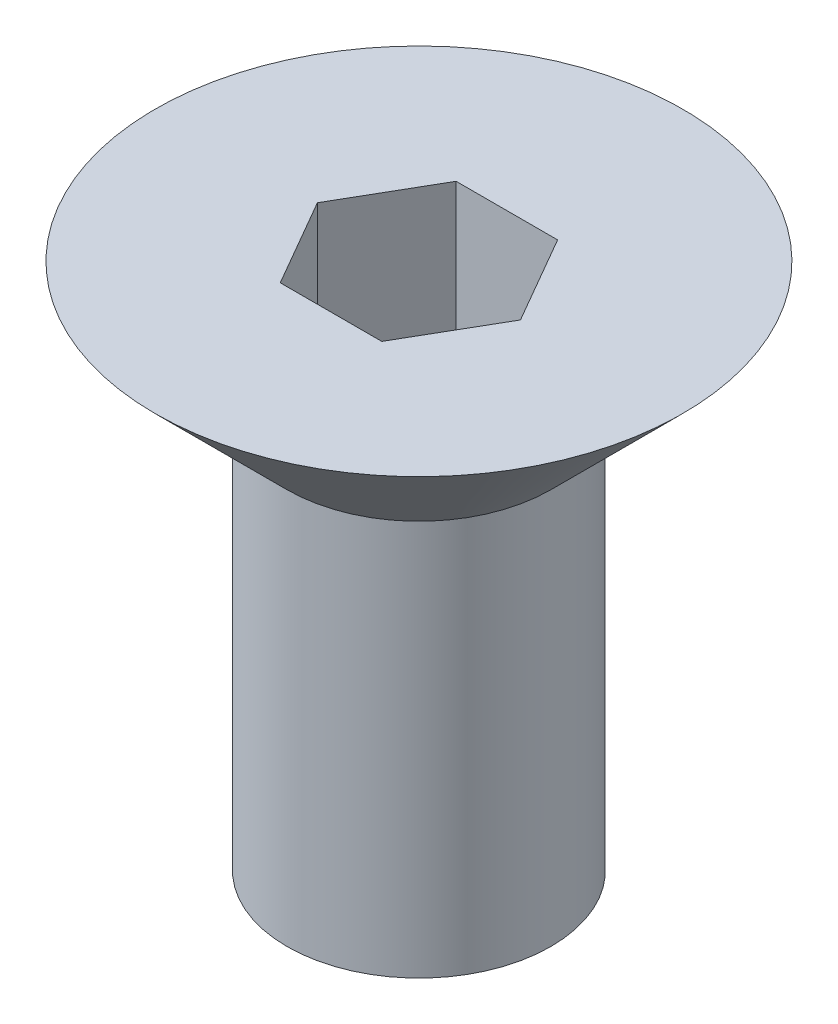
ISO-10303-21;
HEADER;
FILE_DESCRIPTION(('STEP AP214'),'2;1');
FILE_NAME('part.step','',(''),(''),'','','');
FILE_SCHEMA(('AUTOMOTIVE_DESIGN { 1 0 10303 214 1 1 1 1 }'));
ENDSEC;
DATA;
#1=APPLICATION_CONTEXT('core data for automotive mechanical design processes');
#2=APPLICATION_PROTOCOL_DEFINITION('international standard','automotive_design',2000,#1);
#3=PRODUCT_CONTEXT('',#1,'mechanical');
#4=PRODUCT('Part','Part','',(#3));
#5=PRODUCT_RELATED_PRODUCT_CATEGORY('part','',(#4));
#6=PRODUCT_DEFINITION_FORMATION('','',#4);
#7=PRODUCT_DEFINITION_CONTEXT('part definition',#1,'design');
#8=PRODUCT_DEFINITION('design','',#6,#7);
#9=PRODUCT_DEFINITION_SHAPE('','',#8);
#10=(LENGTH_UNIT() NAMED_UNIT(*) SI_UNIT(.MILLI.,.METRE.));
#11=(NAMED_UNIT(*) PLANE_ANGLE_UNIT() SI_UNIT($,.RADIAN.));
#12=(NAMED_UNIT(*) SI_UNIT($,.STERADIAN.) SOLID_ANGLE_UNIT());
#13=UNCERTAINTY_MEASURE_WITH_UNIT(LENGTH_MEASURE(1.E-05),#10,'distance_accuracy_value','');
#14=(GEOMETRIC_REPRESENTATION_CONTEXT(3) GLOBAL_UNCERTAINTY_ASSIGNED_CONTEXT((#13)) GLOBAL_UNIT_ASSIGNED_CONTEXT((#10,
#11,#12)) REPRESENTATION_CONTEXT('',''));
#15=CARTESIAN_POINT('',(0.,0.,0.));
#16=DIRECTION('',(0.,0.,1.));
#17=DIRECTION('',(1.,0.,0.));
#18=AXIS2_PLACEMENT_3D('',#15,#16,#17);
#19=CARTESIAN_POINT('',(0.,-12.,0.));
#20=DIRECTION('',(0.,1.,0.));
#21=DIRECTION('',(0.,0.,1.));
#22=AXIS2_PLACEMENT_3D('',#19,#20,#21);
#23=PLANE('',#22);
#24=CARTESIAN_POINT('',(0.,-12.,0.));
#25=DIRECTION('',(0.,1.,0.));
#26=DIRECTION('',(0.,0.,1.));
#27=AXIS2_PLACEMENT_3D('',#24,#25,#26);
#28=CIRCLE('',#27,3.00000000000001);
#29=CARTESIAN_POINT('',(0.,-12.,3.00000000000001));
#30=VERTEX_POINT('',#29);
#31=EDGE_CURVE('E11',#30,#30,#28,.T.);
#32=ORIENTED_EDGE('',*,*,#31,.F.);
#33=EDGE_LOOP('',(#32));
#34=FACE_BOUND('',#33,.T.);
#35=ADVANCED_FACE('F34',(#34),#23,.F.);
#36=CARTESIAN_POINT('',(0.,61.6916426261037,0.));
#37=DIRECTION('',(0.,1.,0.));
#38=DIRECTION('',(0.,0.,1.));
#39=AXIS2_PLACEMENT_3D('',#36,#37,#38);
#40=CYLINDRICAL_SURFACE('',#39,3.00000000000001);
#41=CARTESIAN_POINT('',(0.,-3.,0.));
#42=DIRECTION('',(0.,1.,0.));
#43=DIRECTION('',(0.,0.,1.));
#44=AXIS2_PLACEMENT_3D('',#41,#42,#43);
#45=CIRCLE('',#44,3.00000000000001);
#46=CARTESIAN_POINT('',(0.,-3.,3.00000000000001));
#47=VERTEX_POINT('',#46);
#48=EDGE_CURVE('E41',#47,#47,#45,.T.);
#49=ORIENTED_EDGE('',*,*,#48,.F.);
#50=EDGE_LOOP('',(#49));
#51=FACE_BOUND('',#50,.T.);
#52=ORIENTED_EDGE('',*,*,#31,.T.);
#53=EDGE_LOOP('',(#52));
#54=FACE_BOUND('',#53,.T.);
#55=ADVANCED_FACE('F147',(#51,#54),#40,.T.);
#56=CARTESIAN_POINT('',(0.,-3.,0.));
#57=DIRECTION('',(0.,1.,0.));
#58=DIRECTION('',(0.,0.,1.));
#59=AXIS2_PLACEMENT_3D('',#56,#57,#58);
#60=CONICAL_SURFACE('',#59,3.00000000000001,0.785398163397448);
#61=CARTESIAN_POINT('',(0.,0.,0.));
#62=DIRECTION('',(0.,1.,0.));
#63=DIRECTION('',(0.,0.,1.));
#64=AXIS2_PLACEMENT_3D('',#61,#62,#63);
#65=CIRCLE('',#64,6.00000000000001);
#66=CARTESIAN_POINT('',(0.,0.,6.00000000000001));
#67=VERTEX_POINT('',#66);
#68=EDGE_CURVE('E135',#67,#67,#65,.T.);
#69=ORIENTED_EDGE('',*,*,#68,.F.);
#70=EDGE_LOOP('',(#69));
#71=FACE_BOUND('',#70,.T.);
#72=ORIENTED_EDGE('',*,*,#48,.T.);
#73=EDGE_LOOP('',(#72));
#74=FACE_BOUND('',#73,.T.);
#75=ADVANCED_FACE('F145',(#71,#74),#60,.T.);
#76=CARTESIAN_POINT('',(6.00000000000001,0.,0.));
#77=DIRECTION('',(0.,-1.,0.));
#78=DIRECTION('',(0.,0.,-1.));
#79=AXIS2_PLACEMENT_3D('',#76,#77,#78);
#80=PLANE('',#79);
#81=DIRECTION('',(-1.,0.,0.));
#82=VECTOR('',#81,1.);
#83=CARTESIAN_POINT('',(1.15470053837925,0.,-2.));
#84=LINE('',#83,#82);
#85=CARTESIAN_POINT('',(1.15470053837925,0.,-2.));
#86=VERTEX_POINT('',#85);
#87=CARTESIAN_POINT('',(-1.15470053837925,0.,-2.));
#88=VERTEX_POINT('',#87);
#89=EDGE_CURVE('E122',#86,#88,#84,.T.);
#90=ORIENTED_EDGE('',*,*,#89,.F.);
#91=DIRECTION('',(-0.5,0.,-0.866025403784439));
#92=VECTOR('',#91,1.);
#93=CARTESIAN_POINT('',(2.3094010767585,0.,0.));
#94=LINE('',#93,#92);
#95=CARTESIAN_POINT('',(2.3094010767585,0.,0.));
#96=VERTEX_POINT('',#95);
#97=EDGE_CURVE('E48',#96,#86,#94,.T.);
#98=ORIENTED_EDGE('',*,*,#97,.F.);
#99=DIRECTION('',(0.5,0.,-0.866025403784439));
#100=VECTOR('',#99,1.);
#101=CARTESIAN_POINT('',(1.15470053837925,0.,2.));
#102=LINE('',#101,#100);
#103=CARTESIAN_POINT('',(1.15470053837925,0.,2.));
#104=VERTEX_POINT('',#103);
#105=EDGE_CURVE('E131',#104,#96,#102,.T.);
#106=ORIENTED_EDGE('',*,*,#105,.F.);
#107=DIRECTION('',(1.,0.,0.));
#108=VECTOR('',#107,1.);
#109=CARTESIAN_POINT('',(-1.15470053837925,0.,2.));
#110=LINE('',#109,#108);
#111=CARTESIAN_POINT('',(-1.15470053837925,0.,2.));
#112=VERTEX_POINT('',#111);
#113=EDGE_CURVE('E129',#112,#104,#110,.T.);
#114=ORIENTED_EDGE('',*,*,#113,.F.);
#115=DIRECTION('',(0.5,0.,0.866025403784439));
#116=VECTOR('',#115,1.);
#117=CARTESIAN_POINT('',(-2.3094010767585,0.,0.));
#118=LINE('',#117,#116);
#119=CARTESIAN_POINT('',(-2.3094010767585,0.,0.));
#120=VERTEX_POINT('',#119);
#121=EDGE_CURVE('E96',#120,#112,#118,.T.);
#122=ORIENTED_EDGE('',*,*,#121,.F.);
#123=DIRECTION('',(-0.5,0.,0.866025403784439));
#124=VECTOR('',#123,1.);
#125=CARTESIAN_POINT('',(-1.15470053837925,0.,-2.));
#126=LINE('',#125,#124);
#127=EDGE_CURVE('E125',#88,#120,#126,.T.);
#128=ORIENTED_EDGE('',*,*,#127,.F.);
#129=EDGE_LOOP('',(#90,#98,#106,#114,#122,#128));
#130=FACE_BOUND('',#129,.T.);
#131=ORIENTED_EDGE('',*,*,#68,.T.);
#132=EDGE_LOOP('',(#131));
#133=FACE_BOUND('',#132,.T.);
#134=ADVANCED_FACE('F165',(#130,#133),#80,.F.);
#135=CARTESIAN_POINT('',(2.3094010767585,-3.,0.));
#136=DIRECTION('',(0.866025403784438,0.,-0.5));
#137=DIRECTION('',(-0.5,0.,-0.866025403784439));
#138=AXIS2_PLACEMENT_3D('',#135,#136,#137);
#139=PLANE('',#138);
#140=ORIENTED_EDGE('',*,*,#97,.T.);
#141=DIRECTION('',(0.,1.,0.));
#142=VECTOR('',#141,1.);
#143=CARTESIAN_POINT('',(1.15470053837925,-3.,-2.));
#144=LINE('',#143,#142);
#145=CARTESIAN_POINT('',(1.15470053837925,-3.,-2.));
#146=VERTEX_POINT('',#145);
#147=EDGE_CURVE('E78',#146,#86,#144,.T.);
#148=ORIENTED_EDGE('',*,*,#147,.F.);
#149=DIRECTION('',(-0.5,0.,-0.866025403784439));
#150=VECTOR('',#149,1.);
#151=CARTESIAN_POINT('',(2.3094010767585,-3.,0.));
#152=LINE('',#151,#150);
#153=CARTESIAN_POINT('',(2.3094010767585,-3.,0.));
#154=VERTEX_POINT('',#153);
#155=EDGE_CURVE('E133',#154,#146,#152,.T.);
#156=ORIENTED_EDGE('',*,*,#155,.F.);
#157=DIRECTION('',(0.,1.,0.));
#158=VECTOR('',#157,1.);
#159=CARTESIAN_POINT('',(2.3094010767585,-3.,0.));
#160=LINE('',#159,#158);
#161=EDGE_CURVE('E56',#154,#96,#160,.T.);
#162=ORIENTED_EDGE('',*,*,#161,.T.);
#163=EDGE_LOOP('',(#140,#148,#156,#162));
#164=FACE_BOUND('',#163,.T.);
#165=ADVANCED_FACE('F173',(#164),#139,.F.);
#166=CARTESIAN_POINT('',(1.15470053837925,-3.,2.));
#167=DIRECTION('',(0.866025403784439,0.,0.5));
#168=DIRECTION('',(0.5,0.,-0.866025403784439));
#169=AXIS2_PLACEMENT_3D('',#166,#167,#168);
#170=PLANE('',#169);
#171=ORIENTED_EDGE('',*,*,#105,.T.);
#172=ORIENTED_EDGE('',*,*,#161,.F.);
#173=DIRECTION('',(0.5,0.,-0.866025403784439));
#174=VECTOR('',#173,1.);
#175=CARTESIAN_POINT('',(1.15470053837925,-3.,2.));
#176=LINE('',#175,#174);
#177=CARTESIAN_POINT('',(1.15470053837925,-3.,2.));
#178=VERTEX_POINT('',#177);
#179=EDGE_CURVE('E108',#178,#154,#176,.T.);
#180=ORIENTED_EDGE('',*,*,#179,.F.);
#181=DIRECTION('',(0.,1.,0.));
#182=VECTOR('',#181,1.);
#183=CARTESIAN_POINT('',(1.15470053837925,-3.,2.));
#184=LINE('',#183,#182);
#185=EDGE_CURVE('E100',#178,#104,#184,.T.);
#186=ORIENTED_EDGE('',*,*,#185,.T.);
#187=EDGE_LOOP('',(#171,#172,#180,#186));
#188=FACE_BOUND('',#187,.T.);
#189=ADVANCED_FACE('F181',(#188),#170,.F.);
#190=CARTESIAN_POINT('',(-1.15470053837925,-3.,2.));
#191=DIRECTION('',(0.,0.,1.));
#192=DIRECTION('',(1.,0.,0.));
#193=AXIS2_PLACEMENT_3D('',#190,#191,#192);
#194=PLANE('',#193);
#195=ORIENTED_EDGE('',*,*,#113,.T.);
#196=ORIENTED_EDGE('',*,*,#185,.F.);
#197=DIRECTION('',(1.,0.,0.));
#198=VECTOR('',#197,1.);
#199=CARTESIAN_POINT('',(-1.15470053837925,-3.,2.));
#200=LINE('',#199,#198);
#201=CARTESIAN_POINT('',(-1.15470053837925,-3.,2.));
#202=VERTEX_POINT('',#201);
#203=EDGE_CURVE('E104',#202,#178,#200,.T.);
#204=ORIENTED_EDGE('',*,*,#203,.F.);
#205=DIRECTION('',(0.,1.,0.));
#206=VECTOR('',#205,1.);
#207=CARTESIAN_POINT('',(-1.15470053837925,-3.,2.));
#208=LINE('',#207,#206);
#209=EDGE_CURVE('E89',#202,#112,#208,.T.);
#210=ORIENTED_EDGE('',*,*,#209,.T.);
#211=EDGE_LOOP('',(#195,#196,#204,#210));
#212=FACE_BOUND('',#211,.T.);
#213=ADVANCED_FACE('F105',(#212),#194,.F.);
#214=CARTESIAN_POINT('',(-2.3094010767585,-3.,0.));
#215=DIRECTION('',(-0.866025403784438,0.,0.5));
#216=DIRECTION('',(0.5,0.,0.866025403784439));
#217=AXIS2_PLACEMENT_3D('',#214,#215,#216);
#218=PLANE('',#217);
#219=ORIENTED_EDGE('',*,*,#121,.T.);
#220=ORIENTED_EDGE('',*,*,#209,.F.);
#221=DIRECTION('',(0.5,0.,0.866025403784439));
#222=VECTOR('',#221,1.);
#223=CARTESIAN_POINT('',(-2.3094010767585,-3.,0.));
#224=LINE('',#223,#222);
#225=CARTESIAN_POINT('',(-2.3094010767585,-3.,0.));
#226=VERTEX_POINT('',#225);
#227=EDGE_CURVE('E93',#226,#202,#224,.T.);
#228=ORIENTED_EDGE('',*,*,#227,.F.);
#229=DIRECTION('',(0.,1.,0.));
#230=VECTOR('',#229,1.);
#231=CARTESIAN_POINT('',(-2.3094010767585,-3.,0.));
#232=LINE('',#231,#230);
#233=EDGE_CURVE('E101',#226,#120,#232,.T.);
#234=ORIENTED_EDGE('',*,*,#233,.T.);
#235=EDGE_LOOP('',(#219,#220,#228,#234));
#236=FACE_BOUND('',#235,.T.);
#237=ADVANCED_FACE('F91',(#236),#218,.F.);
#238=CARTESIAN_POINT('',(-1.15470053837925,-3.,-2.));
#239=DIRECTION('',(-0.866025403784439,0.,-0.5));
#240=DIRECTION('',(-0.5,0.,0.866025403784439));
#241=AXIS2_PLACEMENT_3D('',#238,#239,#240);
#242=PLANE('',#241);
#243=ORIENTED_EDGE('',*,*,#127,.T.);
#244=ORIENTED_EDGE('',*,*,#233,.F.);
#245=DIRECTION('',(-0.5,0.,0.866025403784439));
#246=VECTOR('',#245,1.);
#247=CARTESIAN_POINT('',(-1.15470053837925,-3.,-2.));
#248=LINE('',#247,#246);
#249=CARTESIAN_POINT('',(-1.15470053837925,-3.,-2.));
#250=VERTEX_POINT('',#249);
#251=EDGE_CURVE('E114',#250,#226,#248,.T.);
#252=ORIENTED_EDGE('',*,*,#251,.F.);
#253=DIRECTION('',(0.,1.,0.));
#254=VECTOR('',#253,1.);
#255=CARTESIAN_POINT('',(-1.15470053837925,-3.,-2.));
#256=LINE('',#255,#254);
#257=EDGE_CURVE('E138',#250,#88,#256,.T.);
#258=ORIENTED_EDGE('',*,*,#257,.T.);
#259=EDGE_LOOP('',(#243,#244,#252,#258));
#260=FACE_BOUND('',#259,.T.);
#261=ADVANCED_FACE('F200',(#260),#242,.F.);
#262=CARTESIAN_POINT('',(1.15470053837925,-3.,-2.));
#263=DIRECTION('',(0.,0.,-1.));
#264=DIRECTION('',(-1.,0.,0.));
#265=AXIS2_PLACEMENT_3D('',#262,#263,#264);
#266=PLANE('',#265);
#267=ORIENTED_EDGE('',*,*,#89,.T.);
#268=ORIENTED_EDGE('',*,*,#257,.F.);
#269=DIRECTION('',(-1.,0.,0.));
#270=VECTOR('',#269,1.);
#271=CARTESIAN_POINT('',(1.15470053837925,-3.,-2.));
#272=LINE('',#271,#270);
#273=EDGE_CURVE('E116',#146,#250,#272,.T.);
#274=ORIENTED_EDGE('',*,*,#273,.F.);
#275=ORIENTED_EDGE('',*,*,#147,.T.);
#276=EDGE_LOOP('',(#267,#268,#274,#275));
#277=FACE_BOUND('',#276,.T.);
#278=ADVANCED_FACE('F207',(#277),#266,.F.);
#279=CARTESIAN_POINT('',(0.,-3.,-4.));
#280=DIRECTION('',(0.,1.,0.));
#281=DIRECTION('',(0.,0.,1.));
#282=AXIS2_PLACEMENT_3D('',#279,#280,#281);
#283=PLANE('',#282);
#284=ORIENTED_EDGE('',*,*,#155,.T.);
#285=ORIENTED_EDGE('',*,*,#273,.T.);
#286=ORIENTED_EDGE('',*,*,#251,.T.);
#287=ORIENTED_EDGE('',*,*,#227,.T.);
#288=ORIENTED_EDGE('',*,*,#203,.T.);
#289=ORIENTED_EDGE('',*,*,#179,.T.);
#290=EDGE_LOOP('',(#284,#285,#286,#287,#288,#289));
#291=FACE_BOUND('',#290,.T.);
#292=ADVANCED_FACE('F111',(#291),#283,.T.);
#293=CLOSED_SHELL('',(#35,#55,#75,#134,#165,#189,#213,#237,#261,#278,#292));
#294=MANIFOLD_SOLID_BREP('B2',#293);
#295=ADVANCED_BREP_SHAPE_REPRESENTATION('',(#18,#294),#14);
#296=SHAPE_DEFINITION_REPRESENTATION(#9,#295);
ENDSEC;
END-ISO-10303-21;
